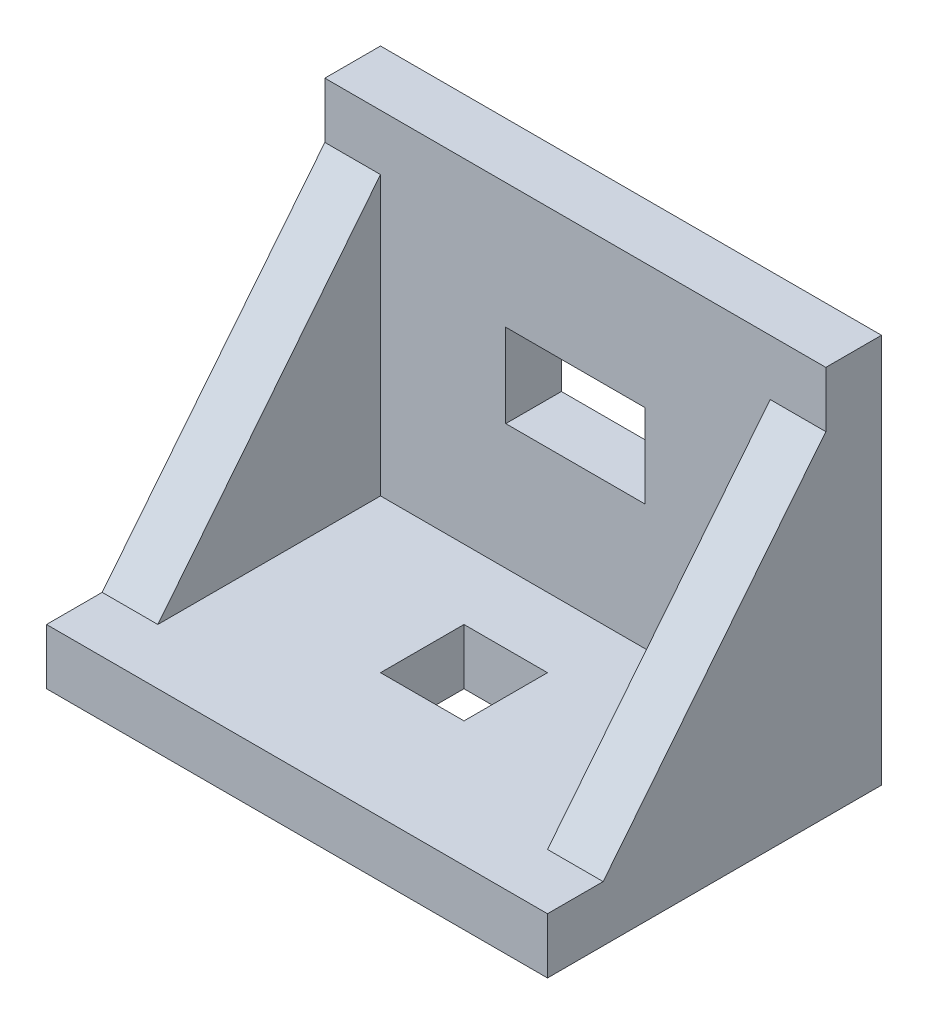
ISO-10303-21;
HEADER;
FILE_DESCRIPTION(('STEP AP214'),'2;1');
FILE_NAME('part.step','',(''),(''),'','','');
FILE_SCHEMA(('AUTOMOTIVE_DESIGN { 1 0 10303 214 1 1 1 1 }'));
ENDSEC;
DATA;
#1=APPLICATION_CONTEXT('core data for automotive mechanical design processes');
#2=APPLICATION_PROTOCOL_DEFINITION('international standard','automotive_design',2000,#1);
#3=PRODUCT_CONTEXT('',#1,'mechanical');
#4=PRODUCT('Part','Part','',(#3));
#5=PRODUCT_RELATED_PRODUCT_CATEGORY('part','',(#4));
#6=PRODUCT_DEFINITION_FORMATION('','',#4);
#7=PRODUCT_DEFINITION_CONTEXT('part definition',#1,'design');
#8=PRODUCT_DEFINITION('design','',#6,#7);
#9=PRODUCT_DEFINITION_SHAPE('','',#8);
#10=(LENGTH_UNIT() NAMED_UNIT(*) SI_UNIT(.MILLI.,.METRE.));
#11=(NAMED_UNIT(*) PLANE_ANGLE_UNIT() SI_UNIT($,.RADIAN.));
#12=(NAMED_UNIT(*) SI_UNIT($,.STERADIAN.) SOLID_ANGLE_UNIT());
#13=UNCERTAINTY_MEASURE_WITH_UNIT(LENGTH_MEASURE(1.E-05),#10,'distance_accuracy_value','');
#14=(GEOMETRIC_REPRESENTATION_CONTEXT(3) GLOBAL_UNCERTAINTY_ASSIGNED_CONTEXT((#13)) GLOBAL_UNIT_ASSIGNED_CONTEXT((#10,
#11,#12)) REPRESENTATION_CONTEXT('',''));
#15=CARTESIAN_POINT('',(0.,0.,0.));
#16=DIRECTION('',(0.,0.,1.));
#17=DIRECTION('',(1.,0.,0.));
#18=AXIS2_PLACEMENT_3D('',#15,#16,#17);
#19=CARTESIAN_POINT('',(45.,10.,-30.));
#20=DIRECTION('',(-1.,0.,0.));
#21=DIRECTION('',(0.,0.,1.));
#22=AXIS2_PLACEMENT_3D('',#19,#20,#21);
#23=PLANE('',#22);
#24=DIRECTION('',(0.,-1.,0.));
#25=VECTOR('',#24,1.);
#26=CARTESIAN_POINT('',(45.,70.,-20.));
#27=LINE('',#26,#25);
#28=CARTESIAN_POINT('',(45.,70.,-20.));
#29=VERTEX_POINT('',#28);
#30=CARTESIAN_POINT('',(45.,60.,-20.));
#31=VERTEX_POINT('',#30);
#32=EDGE_CURVE('E318',#29,#31,#27,.T.);
#33=ORIENTED_EDGE('',*,*,#32,.T.);
#34=DIRECTION('',(0.,0.78086880944303,-0.624695047554424));
#35=VECTOR('',#34,1.);
#36=CARTESIAN_POINT('',(45.,10.,20.));
#37=LINE('',#36,#35);
#38=CARTESIAN_POINT('',(45.,10.,20.));
#39=VERTEX_POINT('',#38);
#40=EDGE_CURVE('E190',#39,#31,#37,.T.);
#41=ORIENTED_EDGE('',*,*,#40,.F.);
#42=DIRECTION('',(0.,0.,-1.));
#43=VECTOR('',#42,1.);
#44=CARTESIAN_POINT('',(45.,10.,-30.));
#45=LINE('',#44,#43);
#46=CARTESIAN_POINT('',(45.,10.,30.));
#47=VERTEX_POINT('',#46);
#48=EDGE_CURVE('E63',#47,#39,#45,.T.);
#49=ORIENTED_EDGE('',*,*,#48,.F.);
#50=DIRECTION('',(0.,-1.,0.));
#51=VECTOR('',#50,1.);
#52=CARTESIAN_POINT('',(45.,10.,30.));
#53=LINE('',#52,#51);
#54=CARTESIAN_POINT('',(45.,0.,30.));
#55=VERTEX_POINT('',#54);
#56=EDGE_CURVE('E336',#47,#55,#53,.T.);
#57=ORIENTED_EDGE('',*,*,#56,.T.);
#58=DIRECTION('',(0.,0.,-1.));
#59=VECTOR('',#58,1.);
#60=CARTESIAN_POINT('',(45.,0.,-30.));
#61=LINE('',#60,#59);
#62=CARTESIAN_POINT('',(45.,0.,-30.));
#63=VERTEX_POINT('',#62);
#64=EDGE_CURVE('E326',#55,#63,#61,.T.);
#65=ORIENTED_EDGE('',*,*,#64,.T.);
#66=DIRECTION('',(0.,-1.,0.));
#67=VECTOR('',#66,1.);
#68=CARTESIAN_POINT('',(45.,10.,-30.));
#69=LINE('',#68,#67);
#70=CARTESIAN_POINT('',(45.,70.,-30.));
#71=VERTEX_POINT('',#70);
#72=EDGE_CURVE('E11',#71,#63,#69,.T.);
#73=ORIENTED_EDGE('',*,*,#72,.F.);
#74=DIRECTION('',(0.,0.,-1.));
#75=VECTOR('',#74,1.);
#76=CARTESIAN_POINT('',(45.,70.,-30.));
#77=LINE('',#76,#75);
#78=EDGE_CURVE('E313',#29,#71,#77,.T.);
#79=ORIENTED_EDGE('',*,*,#78,.F.);
#80=EDGE_LOOP('',(#33,#41,#49,#57,#65,#73,#79));
#81=FACE_BOUND('',#80,.T.);
#82=ADVANCED_FACE('F43',(#81),#23,.F.);
#83=CARTESIAN_POINT('',(-45.,10.,-30.));
#84=DIRECTION('',(0.,0.,1.));
#85=DIRECTION('',(1.,0.,0.));
#86=AXIS2_PLACEMENT_3D('',#83,#84,#85);
#87=PLANE('',#86);
#88=DIRECTION('',(-1.,0.,0.));
#89=VECTOR('',#88,1.);
#90=CARTESIAN_POINT('',(-45.,0.,-30.));
#91=LINE('',#90,#89);
#92=CARTESIAN_POINT('',(-45.,0.,-30.));
#93=VERTEX_POINT('',#92);
#94=EDGE_CURVE('E339',#63,#93,#91,.T.);
#95=ORIENTED_EDGE('',*,*,#94,.T.);
#96=DIRECTION('',(0.,-1.,0.));
#97=VECTOR('',#96,1.);
#98=CARTESIAN_POINT('',(-45.,10.,-30.));
#99=LINE('',#98,#97);
#100=CARTESIAN_POINT('',(-45.,70.,-30.));
#101=VERTEX_POINT('',#100);
#102=EDGE_CURVE('E51',#101,#93,#99,.T.);
#103=ORIENTED_EDGE('',*,*,#102,.F.);
#104=DIRECTION('',(-1.,0.,0.));
#105=VECTOR('',#104,1.);
#106=CARTESIAN_POINT('',(-45.,70.,-30.));
#107=LINE('',#106,#105);
#108=EDGE_CURVE('E316',#71,#101,#107,.T.);
#109=ORIENTED_EDGE('',*,*,#108,.F.);
#110=ORIENTED_EDGE('',*,*,#72,.T.);
#111=EDGE_LOOP('',(#95,#103,#109,#110));
#112=FACE_BOUND('',#111,.T.);
#113=DIRECTION('',(1.,0.,0.));
#114=VECTOR('',#113,1.);
#115=CARTESIAN_POINT('',(-12.5,32.5,-30.));
#116=LINE('',#115,#114);
#117=CARTESIAN_POINT('',(-12.5,32.5,-30.));
#118=VERTEX_POINT('',#117);
#119=CARTESIAN_POINT('',(12.5,32.5,-30.));
#120=VERTEX_POINT('',#119);
#121=EDGE_CURVE('E279',#118,#120,#116,.T.);
#122=ORIENTED_EDGE('',*,*,#121,.T.);
#123=DIRECTION('',(0.,1.,0.));
#124=VECTOR('',#123,1.);
#125=CARTESIAN_POINT('',(12.5,47.5,-30.));
#126=LINE('',#125,#124);
#127=CARTESIAN_POINT('',(12.5,47.5,-30.));
#128=VERTEX_POINT('',#127);
#129=EDGE_CURVE('E266',#120,#128,#126,.T.);
#130=ORIENTED_EDGE('',*,*,#129,.T.);
#131=DIRECTION('',(-1.,0.,0.));
#132=VECTOR('',#131,1.);
#133=CARTESIAN_POINT('',(-12.5,47.5,-30.));
#134=LINE('',#133,#132);
#135=CARTESIAN_POINT('',(-12.5,47.5,-30.));
#136=VERTEX_POINT('',#135);
#137=EDGE_CURVE('E270',#128,#136,#134,.T.);
#138=ORIENTED_EDGE('',*,*,#137,.T.);
#139=DIRECTION('',(0.,-1.,0.));
#140=VECTOR('',#139,1.);
#141=CARTESIAN_POINT('',(-12.5,47.5,-30.));
#142=LINE('',#141,#140);
#143=EDGE_CURVE('E275',#136,#118,#142,.T.);
#144=ORIENTED_EDGE('',*,*,#143,.T.);
#145=EDGE_LOOP('',(#122,#130,#138,#144));
#146=FACE_BOUND('',#145,.T.);
#147=ADVANCED_FACE('F385',(#112,#146),#87,.F.);
#148=CARTESIAN_POINT('',(-45.,10.,-30.));
#149=DIRECTION('',(1.,0.,0.));
#150=DIRECTION('',(0.,0.,-1.));
#151=AXIS2_PLACEMENT_3D('',#148,#149,#150);
#152=PLANE('',#151);
#153=DIRECTION('',(0.,0.,1.));
#154=VECTOR('',#153,1.);
#155=CARTESIAN_POINT('',(-45.,0.,-30.));
#156=LINE('',#155,#154);
#157=CARTESIAN_POINT('',(-45.,0.,30.));
#158=VERTEX_POINT('',#157);
#159=EDGE_CURVE('E342',#93,#158,#156,.T.);
#160=ORIENTED_EDGE('',*,*,#159,.T.);
#161=DIRECTION('',(0.,-1.,0.));
#162=VECTOR('',#161,1.);
#163=CARTESIAN_POINT('',(-45.,10.,30.));
#164=LINE('',#163,#162);
#165=CARTESIAN_POINT('',(-45.,10.,30.));
#166=VERTEX_POINT('',#165);
#167=EDGE_CURVE('E350',#166,#158,#164,.T.);
#168=ORIENTED_EDGE('',*,*,#167,.F.);
#169=DIRECTION('',(0.,0.,1.));
#170=VECTOR('',#169,1.);
#171=CARTESIAN_POINT('',(-45.,10.,-30.));
#172=LINE('',#171,#170);
#173=CARTESIAN_POINT('',(-45.,10.,20.));
#174=VERTEX_POINT('',#173);
#175=EDGE_CURVE('E329',#174,#166,#172,.T.);
#176=ORIENTED_EDGE('',*,*,#175,.F.);
#177=DIRECTION('',(0.,0.78086880944303,-0.624695047554424));
#178=VECTOR('',#177,1.);
#179=CARTESIAN_POINT('',(-45.,10.,20.));
#180=LINE('',#179,#178);
#181=CARTESIAN_POINT('',(-45.,60.,-20.));
#182=VERTEX_POINT('',#181);
#183=EDGE_CURVE('E202',#174,#182,#180,.T.);
#184=ORIENTED_EDGE('',*,*,#183,.T.);
#185=DIRECTION('',(0.,-1.,0.));
#186=VECTOR('',#185,1.);
#187=CARTESIAN_POINT('',(-45.,70.,-20.));
#188=LINE('',#187,#186);
#189=CARTESIAN_POINT('',(-45.,70.,-20.));
#190=VERTEX_POINT('',#189);
#191=EDGE_CURVE('E323',#190,#182,#188,.T.);
#192=ORIENTED_EDGE('',*,*,#191,.F.);
#193=DIRECTION('',(0.,0.,1.));
#194=VECTOR('',#193,1.);
#195=CARTESIAN_POINT('',(-45.,70.,-30.));
#196=LINE('',#195,#194);
#197=EDGE_CURVE('E175',#101,#190,#196,.T.);
#198=ORIENTED_EDGE('',*,*,#197,.F.);
#199=ORIENTED_EDGE('',*,*,#102,.T.);
#200=EDGE_LOOP('',(#160,#168,#176,#184,#192,#198,#199));
#201=FACE_BOUND('',#200,.T.);
#202=ADVANCED_FACE('F359',(#201),#152,.F.);
#203=CARTESIAN_POINT('',(-45.,10.,30.));
#204=DIRECTION('',(0.,0.,-1.));
#205=DIRECTION('',(-1.,0.,0.));
#206=AXIS2_PLACEMENT_3D('',#203,#204,#205);
#207=PLANE('',#206);
#208=DIRECTION('',(1.,0.,0.));
#209=VECTOR('',#208,1.);
#210=CARTESIAN_POINT('',(-45.,0.,30.));
#211=LINE('',#210,#209);
#212=EDGE_CURVE('E330',#158,#55,#211,.T.);
#213=ORIENTED_EDGE('',*,*,#212,.T.);
#214=ORIENTED_EDGE('',*,*,#56,.F.);
#215=DIRECTION('',(1.,0.,0.));
#216=VECTOR('',#215,1.);
#217=CARTESIAN_POINT('',(-45.,10.,30.));
#218=LINE('',#217,#216);
#219=EDGE_CURVE('E333',#166,#47,#218,.T.);
#220=ORIENTED_EDGE('',*,*,#219,.F.);
#221=ORIENTED_EDGE('',*,*,#167,.T.);
#222=EDGE_LOOP('',(#213,#214,#220,#221));
#223=FACE_BOUND('',#222,.T.);
#224=ADVANCED_FACE('F372',(#223),#207,.F.);
#225=CARTESIAN_POINT('',(0.,10.,0.));
#226=DIRECTION('',(0.,1.,0.));
#227=DIRECTION('',(0.,0.,1.));
#228=AXIS2_PLACEMENT_3D('',#225,#226,#227);
#229=PLANE('',#228);
#230=DIRECTION('',(-1.,0.,0.));
#231=VECTOR('',#230,1.);
#232=CARTESIAN_POINT('',(0.,10.,20.));
#233=LINE('',#232,#231);
#234=CARTESIAN_POINT('',(35.,10.,20.));
#235=VERTEX_POINT('',#234);
#236=EDGE_CURVE('E58',#235,#39,#233,.F.);
#237=ORIENTED_EDGE('',*,*,#236,.F.);
#238=DIRECTION('',(0.,0.,-1.));
#239=VECTOR('',#238,1.);
#240=CARTESIAN_POINT('',(35.,10.,0.));
#241=LINE('',#240,#239);
#242=CARTESIAN_POINT('',(35.,10.,-20.));
#243=VERTEX_POINT('',#242);
#244=EDGE_CURVE('E178',#235,#243,#241,.T.);
#245=ORIENTED_EDGE('',*,*,#244,.T.);
#246=DIRECTION('',(1.,0.,0.));
#247=VECTOR('',#246,1.);
#248=CARTESIAN_POINT('',(-45.,10.,-20.));
#249=LINE('',#248,#247);
#250=CARTESIAN_POINT('',(-35.,10.,-20.));
#251=VERTEX_POINT('',#250);
#252=EDGE_CURVE('E166',#251,#243,#249,.T.);
#253=ORIENTED_EDGE('',*,*,#252,.F.);
#254=DIRECTION('',(0.,0.,1.));
#255=VECTOR('',#254,1.);
#256=CARTESIAN_POINT('',(-35.,10.,0.));
#257=LINE('',#256,#255);
#258=CARTESIAN_POINT('',(-35.,10.,20.));
#259=VERTEX_POINT('',#258);
#260=EDGE_CURVE('E211',#251,#259,#257,.T.);
#261=ORIENTED_EDGE('',*,*,#260,.T.);
#262=DIRECTION('',(1.,0.,0.));
#263=VECTOR('',#262,1.);
#264=CARTESIAN_POINT('',(0.,10.,20.));
#265=LINE('',#264,#263);
#266=EDGE_CURVE('E217',#174,#259,#265,.T.);
#267=ORIENTED_EDGE('',*,*,#266,.F.);
#268=ORIENTED_EDGE('',*,*,#175,.T.);
#269=ORIENTED_EDGE('',*,*,#219,.T.);
#270=ORIENTED_EDGE('',*,*,#48,.T.);
#271=EDGE_LOOP('',(#237,#245,#253,#261,#267,#268,#269,#270));
#272=FACE_BOUND('',#271,.T.);
#273=DIRECTION('',(0.,0.,-1.));
#274=VECTOR('',#273,1.);
#275=CARTESIAN_POINT('',(7.5,10.,-7.5));
#276=LINE('',#275,#274);
#277=CARTESIAN_POINT('',(7.5,10.,7.5));
#278=VERTEX_POINT('',#277);
#279=CARTESIAN_POINT('',(7.5,10.,-7.5));
#280=VERTEX_POINT('',#279);
#281=EDGE_CURVE('E221',#278,#280,#276,.T.);
#282=ORIENTED_EDGE('',*,*,#281,.F.);
#283=DIRECTION('',(1.,0.,0.));
#284=VECTOR('',#283,1.);
#285=CARTESIAN_POINT('',(-7.5,10.,7.5));
#286=LINE('',#285,#284);
#287=CARTESIAN_POINT('',(-7.5,10.,7.5));
#288=VERTEX_POINT('',#287);
#289=EDGE_CURVE('E227',#288,#278,#286,.T.);
#290=ORIENTED_EDGE('',*,*,#289,.F.);
#291=DIRECTION('',(0.,0.,1.));
#292=VECTOR('',#291,1.);
#293=CARTESIAN_POINT('',(-7.5,10.,-7.5));
#294=LINE('',#293,#292);
#295=CARTESIAN_POINT('',(-7.5,10.,-7.5));
#296=VERTEX_POINT('',#295);
#297=EDGE_CURVE('E246',#296,#288,#294,.T.);
#298=ORIENTED_EDGE('',*,*,#297,.F.);
#299=DIRECTION('',(-1.,0.,0.));
#300=VECTOR('',#299,1.);
#301=CARTESIAN_POINT('',(-7.5,10.,-7.5));
#302=LINE('',#301,#300);
#303=EDGE_CURVE('E242',#280,#296,#302,.T.);
#304=ORIENTED_EDGE('',*,*,#303,.F.);
#305=EDGE_LOOP('',(#282,#290,#298,#304));
#306=FACE_BOUND('',#305,.T.);
#307=ADVANCED_FACE('F179',(#272,#306),#229,.T.);
#308=CARTESIAN_POINT('',(0.,0.,0.));
#309=DIRECTION('',(0.,1.,0.));
#310=DIRECTION('',(0.,0.,1.));
#311=AXIS2_PLACEMENT_3D('',#308,#309,#310);
#312=PLANE('',#311);
#313=ORIENTED_EDGE('',*,*,#94,.F.);
#314=ORIENTED_EDGE('',*,*,#64,.F.);
#315=ORIENTED_EDGE('',*,*,#212,.F.);
#316=ORIENTED_EDGE('',*,*,#159,.F.);
#317=EDGE_LOOP('',(#313,#314,#315,#316));
#318=FACE_BOUND('',#317,.T.);
#319=DIRECTION('',(1.,0.,0.));
#320=VECTOR('',#319,1.);
#321=CARTESIAN_POINT('',(-7.5,0.,7.5));
#322=LINE('',#321,#320);
#323=CARTESIAN_POINT('',(-7.5,0.,7.5));
#324=VERTEX_POINT('',#323);
#325=CARTESIAN_POINT('',(7.5,0.,7.5));
#326=VERTEX_POINT('',#325);
#327=EDGE_CURVE('E235',#324,#326,#322,.T.);
#328=ORIENTED_EDGE('',*,*,#327,.T.);
#329=DIRECTION('',(0.,0.,-1.));
#330=VECTOR('',#329,1.);
#331=CARTESIAN_POINT('',(7.5,0.,-7.5));
#332=LINE('',#331,#330);
#333=CARTESIAN_POINT('',(7.5,0.,-7.5));
#334=VERTEX_POINT('',#333);
#335=EDGE_CURVE('E222',#326,#334,#332,.T.);
#336=ORIENTED_EDGE('',*,*,#335,.T.);
#337=DIRECTION('',(-1.,0.,0.));
#338=VECTOR('',#337,1.);
#339=CARTESIAN_POINT('',(-7.5,0.,-7.5));
#340=LINE('',#339,#338);
#341=CARTESIAN_POINT('',(-7.5,0.,-7.5));
#342=VERTEX_POINT('',#341);
#343=EDGE_CURVE('E226',#334,#342,#340,.T.);
#344=ORIENTED_EDGE('',*,*,#343,.T.);
#345=DIRECTION('',(0.,0.,1.));
#346=VECTOR('',#345,1.);
#347=CARTESIAN_POINT('',(-7.5,0.,-7.5));
#348=LINE('',#347,#346);
#349=EDGE_CURVE('E231',#342,#324,#348,.T.);
#350=ORIENTED_EDGE('',*,*,#349,.T.);
#351=EDGE_LOOP('',(#328,#336,#344,#350));
#352=FACE_BOUND('',#351,.T.);
#353=ADVANCED_FACE('F367',(#318,#352),#312,.F.);
#354=CARTESIAN_POINT('',(-45.,70.,-20.));
#355=DIRECTION('',(0.,0.,-1.));
#356=DIRECTION('',(-1.,0.,0.));
#357=AXIS2_PLACEMENT_3D('',#354,#355,#356);
#358=PLANE('',#357);
#359=DIRECTION('',(-1.,0.,0.));
#360=VECTOR('',#359,1.);
#361=CARTESIAN_POINT('',(-12.5,47.5,-20.));
#362=LINE('',#361,#360);
#363=CARTESIAN_POINT('',(12.5,47.5,-20.));
#364=VERTEX_POINT('',#363);
#365=CARTESIAN_POINT('',(-12.5,47.5,-20.));
#366=VERTEX_POINT('',#365);
#367=EDGE_CURVE('E286',#364,#366,#362,.T.);
#368=ORIENTED_EDGE('',*,*,#367,.F.);
#369=DIRECTION('',(0.,1.,0.));
#370=VECTOR('',#369,1.);
#371=CARTESIAN_POINT('',(12.5,47.5,-20.));
#372=LINE('',#371,#370);
#373=CARTESIAN_POINT('',(12.5,32.5,-20.));
#374=VERTEX_POINT('',#373);
#375=EDGE_CURVE('E256',#374,#364,#372,.T.);
#376=ORIENTED_EDGE('',*,*,#375,.F.);
#377=DIRECTION('',(1.,0.,0.));
#378=VECTOR('',#377,1.);
#379=CARTESIAN_POINT('',(-12.5,32.5,-20.));
#380=LINE('',#379,#378);
#381=CARTESIAN_POINT('',(-12.5,32.5,-20.));
#382=VERTEX_POINT('',#381);
#383=EDGE_CURVE('E271',#382,#374,#380,.T.);
#384=ORIENTED_EDGE('',*,*,#383,.F.);
#385=DIRECTION('',(0.,-1.,0.));
#386=VECTOR('',#385,1.);
#387=CARTESIAN_POINT('',(-12.5,47.5,-20.));
#388=LINE('',#387,#386);
#389=EDGE_CURVE('E290',#366,#382,#388,.T.);
#390=ORIENTED_EDGE('',*,*,#389,.F.);
#391=EDGE_LOOP('',(#368,#376,#384,#390));
#392=FACE_BOUND('',#391,.T.);
#393=DIRECTION('',(0.,-1.,0.));
#394=VECTOR('',#393,1.);
#395=CARTESIAN_POINT('',(35.,70.,-20.));
#396=LINE('',#395,#394);
#397=CARTESIAN_POINT('',(35.,60.,-20.));
#398=VERTEX_POINT('',#397);
#399=EDGE_CURVE('E169',#398,#243,#396,.T.);
#400=ORIENTED_EDGE('',*,*,#399,.F.);
#401=DIRECTION('',(-1.,0.,0.));
#402=VECTOR('',#401,1.);
#403=CARTESIAN_POINT('',(-45.,60.,-20.));
#404=LINE('',#403,#402);
#405=EDGE_CURVE('E185',#398,#31,#404,.F.);
#406=ORIENTED_EDGE('',*,*,#405,.T.);
#407=ORIENTED_EDGE('',*,*,#32,.F.);
#408=DIRECTION('',(1.,0.,0.));
#409=VECTOR('',#408,1.);
#410=CARTESIAN_POINT('',(-45.,70.,-20.));
#411=LINE('',#410,#409);
#412=EDGE_CURVE('E310',#190,#29,#411,.T.);
#413=ORIENTED_EDGE('',*,*,#412,.F.);
#414=ORIENTED_EDGE('',*,*,#191,.T.);
#415=DIRECTION('',(1.,0.,0.));
#416=VECTOR('',#415,1.);
#417=CARTESIAN_POINT('',(-45.,60.,-20.));
#418=LINE('',#417,#416);
#419=CARTESIAN_POINT('',(-35.,60.,-20.));
#420=VERTEX_POINT('',#419);
#421=EDGE_CURVE('E214',#182,#420,#418,.T.);
#422=ORIENTED_EDGE('',*,*,#421,.T.);
#423=DIRECTION('',(0.,1.,0.));
#424=VECTOR('',#423,1.);
#425=CARTESIAN_POINT('',(-35.,70.,-20.));
#426=LINE('',#425,#424);
#427=EDGE_CURVE('E172',#251,#420,#426,.T.);
#428=ORIENTED_EDGE('',*,*,#427,.F.);
#429=ORIENTED_EDGE('',*,*,#252,.T.);
#430=EDGE_LOOP('',(#400,#406,#407,#413,#414,#422,#428,#429));
#431=FACE_BOUND('',#430,.T.);
#432=ADVANCED_FACE('F167',(#392,#431),#358,.F.);
#433=CARTESIAN_POINT('',(0.,70.,0.));
#434=DIRECTION('',(0.,1.,0.));
#435=DIRECTION('',(0.,0.,1.));
#436=AXIS2_PLACEMENT_3D('',#433,#434,#435);
#437=PLANE('',#436);
#438=ORIENTED_EDGE('',*,*,#78,.T.);
#439=ORIENTED_EDGE('',*,*,#108,.T.);
#440=ORIENTED_EDGE('',*,*,#197,.T.);
#441=ORIENTED_EDGE('',*,*,#412,.T.);
#442=EDGE_LOOP('',(#438,#439,#440,#441));
#443=FACE_BOUND('',#442,.T.);
#444=ADVANCED_FACE('F384',(#443),#437,.T.);
#445=CARTESIAN_POINT('',(12.5,47.5,-30.));
#446=DIRECTION('',(1.,0.,0.));
#447=DIRECTION('',(0.,1.,0.));
#448=AXIS2_PLACEMENT_3D('',#445,#446,#447);
#449=PLANE('',#448);
#450=ORIENTED_EDGE('',*,*,#375,.T.);
#451=DIRECTION('',(0.,0.,1.));
#452=VECTOR('',#451,1.);
#453=CARTESIAN_POINT('',(12.5,47.5,-30.));
#454=LINE('',#453,#452);
#455=EDGE_CURVE('E283',#128,#364,#454,.T.);
#456=ORIENTED_EDGE('',*,*,#455,.F.);
#457=ORIENTED_EDGE('',*,*,#129,.F.);
#458=DIRECTION('',(0.,0.,1.));
#459=VECTOR('',#458,1.);
#460=CARTESIAN_POINT('',(12.5,32.5,-30.));
#461=LINE('',#460,#459);
#462=EDGE_CURVE('E176',#120,#374,#461,.T.);
#463=ORIENTED_EDGE('',*,*,#462,.T.);
#464=EDGE_LOOP('',(#450,#456,#457,#463));
#465=FACE_BOUND('',#464,.T.);
#466=ADVANCED_FACE('F395',(#465),#449,.F.);
#467=CARTESIAN_POINT('',(-12.5,32.5,-30.));
#468=DIRECTION('',(0.,-1.,0.));
#469=DIRECTION('',(0.,0.,-1.));
#470=AXIS2_PLACEMENT_3D('',#467,#468,#469);
#471=PLANE('',#470);
#472=ORIENTED_EDGE('',*,*,#383,.T.);
#473=ORIENTED_EDGE('',*,*,#462,.F.);
#474=ORIENTED_EDGE('',*,*,#121,.F.);
#475=DIRECTION('',(0.,0.,1.));
#476=VECTOR('',#475,1.);
#477=CARTESIAN_POINT('',(-12.5,32.5,-30.));
#478=LINE('',#477,#476);
#479=EDGE_CURVE('E299',#118,#382,#478,.T.);
#480=ORIENTED_EDGE('',*,*,#479,.T.);
#481=EDGE_LOOP('',(#472,#473,#474,#480));
#482=FACE_BOUND('',#481,.T.);
#483=ADVANCED_FACE('F391',(#482),#471,.F.);
#484=CARTESIAN_POINT('',(-12.5,47.5,-30.));
#485=DIRECTION('',(-1.,0.,0.));
#486=DIRECTION('',(0.,-1.,0.));
#487=AXIS2_PLACEMENT_3D('',#484,#485,#486);
#488=PLANE('',#487);
#489=ORIENTED_EDGE('',*,*,#389,.T.);
#490=ORIENTED_EDGE('',*,*,#479,.F.);
#491=ORIENTED_EDGE('',*,*,#143,.F.);
#492=DIRECTION('',(0.,0.,1.));
#493=VECTOR('',#492,1.);
#494=CARTESIAN_POINT('',(-12.5,47.5,-30.));
#495=LINE('',#494,#493);
#496=EDGE_CURVE('E302',#136,#366,#495,.T.);
#497=ORIENTED_EDGE('',*,*,#496,.T.);
#498=EDGE_LOOP('',(#489,#490,#491,#497));
#499=FACE_BOUND('',#498,.T.);
#500=ADVANCED_FACE('F403',(#499),#488,.F.);
#501=CARTESIAN_POINT('',(-12.5,47.5,-30.));
#502=DIRECTION('',(0.,1.,0.));
#503=DIRECTION('',(0.,0.,1.));
#504=AXIS2_PLACEMENT_3D('',#501,#502,#503);
#505=PLANE('',#504);
#506=ORIENTED_EDGE('',*,*,#367,.T.);
#507=ORIENTED_EDGE('',*,*,#496,.F.);
#508=ORIENTED_EDGE('',*,*,#137,.F.);
#509=ORIENTED_EDGE('',*,*,#455,.T.);
#510=EDGE_LOOP('',(#506,#507,#508,#509));
#511=FACE_BOUND('',#510,.T.);
#512=ADVANCED_FACE('F400',(#511),#505,.F.);
#513=CARTESIAN_POINT('',(7.5,0.,-7.5));
#514=DIRECTION('',(1.,0.,0.));
#515=DIRECTION('',(0.,0.,-1.));
#516=AXIS2_PLACEMENT_3D('',#513,#514,#515);
#517=PLANE('',#516);
#518=ORIENTED_EDGE('',*,*,#281,.T.);
#519=DIRECTION('',(0.,1.,0.));
#520=VECTOR('',#519,1.);
#521=CARTESIAN_POINT('',(7.5,0.,-7.5));
#522=LINE('',#521,#520);
#523=EDGE_CURVE('E239',#334,#280,#522,.T.);
#524=ORIENTED_EDGE('',*,*,#523,.F.);
#525=ORIENTED_EDGE('',*,*,#335,.F.);
#526=DIRECTION('',(0.,1.,0.));
#527=VECTOR('',#526,1.);
#528=CARTESIAN_POINT('',(7.5,0.,7.5));
#529=LINE('',#528,#527);
#530=EDGE_CURVE('E253',#326,#278,#529,.T.);
#531=ORIENTED_EDGE('',*,*,#530,.T.);
#532=EDGE_LOOP('',(#518,#524,#525,#531));
#533=FACE_BOUND('',#532,.T.);
#534=ADVANCED_FACE('F530',(#533),#517,.F.);
#535=CARTESIAN_POINT('',(-7.5,0.,7.5));
#536=DIRECTION('',(0.,0.,1.));
#537=DIRECTION('',(1.,0.,0.));
#538=AXIS2_PLACEMENT_3D('',#535,#536,#537);
#539=PLANE('',#538);
#540=ORIENTED_EDGE('',*,*,#289,.T.);
#541=ORIENTED_EDGE('',*,*,#530,.F.);
#542=ORIENTED_EDGE('',*,*,#327,.F.);
#543=DIRECTION('',(0.,1.,0.));
#544=VECTOR('',#543,1.);
#545=CARTESIAN_POINT('',(-7.5,0.,7.5));
#546=LINE('',#545,#544);
#547=EDGE_CURVE('E257',#324,#288,#546,.T.);
#548=ORIENTED_EDGE('',*,*,#547,.T.);
#549=EDGE_LOOP('',(#540,#541,#542,#548));
#550=FACE_BOUND('',#549,.T.);
#551=ADVANCED_FACE('F520',(#550),#539,.F.);
#552=CARTESIAN_POINT('',(-7.5,0.,-7.5));
#553=DIRECTION('',(-1.,0.,0.));
#554=DIRECTION('',(0.,0.,1.));
#555=AXIS2_PLACEMENT_3D('',#552,#553,#554);
#556=PLANE('',#555);
#557=ORIENTED_EDGE('',*,*,#297,.T.);
#558=ORIENTED_EDGE('',*,*,#547,.F.);
#559=ORIENTED_EDGE('',*,*,#349,.F.);
#560=DIRECTION('',(0.,1.,0.));
#561=VECTOR('',#560,1.);
#562=CARTESIAN_POINT('',(-7.5,0.,-7.5));
#563=LINE('',#562,#561);
#564=EDGE_CURVE('E260',#342,#296,#563,.T.);
#565=ORIENTED_EDGE('',*,*,#564,.T.);
#566=EDGE_LOOP('',(#557,#558,#559,#565));
#567=FACE_BOUND('',#566,.T.);
#568=ADVANCED_FACE('F511',(#567),#556,.F.);
#569=CARTESIAN_POINT('',(-7.5,0.,-7.5));
#570=DIRECTION('',(0.,0.,-1.));
#571=DIRECTION('',(-1.,0.,0.));
#572=AXIS2_PLACEMENT_3D('',#569,#570,#571);
#573=PLANE('',#572);
#574=ORIENTED_EDGE('',*,*,#303,.T.);
#575=ORIENTED_EDGE('',*,*,#564,.F.);
#576=ORIENTED_EDGE('',*,*,#343,.F.);
#577=ORIENTED_EDGE('',*,*,#523,.T.);
#578=EDGE_LOOP('',(#574,#575,#576,#577));
#579=FACE_BOUND('',#578,.T.);
#580=ADVANCED_FACE('F502',(#579),#573,.F.);
#581=CARTESIAN_POINT('',(-45.,10.,20.));
#582=DIRECTION('',(0.,0.624695047554424,0.78086880944303));
#583=DIRECTION('',(0.,0.78086880944303,-0.624695047554424));
#584=AXIS2_PLACEMENT_3D('',#581,#582,#583);
#585=PLANE('',#584);
#586=ORIENTED_EDGE('',*,*,#183,.F.);
#587=ORIENTED_EDGE('',*,*,#266,.T.);
#588=DIRECTION('',(0.,0.78086880944303,-0.624695047554424));
#589=VECTOR('',#588,1.);
#590=CARTESIAN_POINT('',(-35.,10.,20.));
#591=LINE('',#590,#589);
#592=EDGE_CURVE('E201',#259,#420,#591,.T.);
#593=ORIENTED_EDGE('',*,*,#592,.T.);
#594=ORIENTED_EDGE('',*,*,#421,.F.);
#595=EDGE_LOOP('',(#586,#587,#593,#594));
#596=FACE_BOUND('',#595,.T.);
#597=ADVANCED_FACE('F493',(#596),#585,.T.);
#598=CARTESIAN_POINT('',(-35.,35.,0.));
#599=DIRECTION('',(-1.,0.,0.));
#600=DIRECTION('',(0.,0.,1.));
#601=AXIS2_PLACEMENT_3D('',#598,#599,#600);
#602=PLANE('',#601);
#603=ORIENTED_EDGE('',*,*,#260,.F.);
#604=ORIENTED_EDGE('',*,*,#427,.T.);
#605=ORIENTED_EDGE('',*,*,#592,.F.);
#606=EDGE_LOOP('',(#603,#604,#605));
#607=FACE_BOUND('',#606,.T.);
#608=ADVANCED_FACE('F472',(#607),#602,.F.);
#609=CARTESIAN_POINT('',(45.,10.,20.));
#610=DIRECTION('',(0.,-0.624695047554424,-0.78086880944303));
#611=DIRECTION('',(0.,0.78086880944303,-0.624695047554424));
#612=AXIS2_PLACEMENT_3D('',#609,#610,#611);
#613=PLANE('',#612);
#614=DIRECTION('',(0.,0.78086880944303,-0.624695047554424));
#615=VECTOR('',#614,1.);
#616=CARTESIAN_POINT('',(35.,10.,20.));
#617=LINE('',#616,#615);
#618=EDGE_CURVE('E188',#235,#398,#617,.T.);
#619=ORIENTED_EDGE('',*,*,#618,.F.);
#620=ORIENTED_EDGE('',*,*,#236,.T.);
#621=ORIENTED_EDGE('',*,*,#40,.T.);
#622=ORIENTED_EDGE('',*,*,#405,.F.);
#623=EDGE_LOOP('',(#619,#620,#621,#622));
#624=FACE_BOUND('',#623,.T.);
#625=ADVANCED_FACE('F380',(#624),#613,.F.);
#626=CARTESIAN_POINT('',(35.,35.,0.));
#627=DIRECTION('',(1.,0.,0.));
#628=DIRECTION('',(0.,0.,-1.));
#629=AXIS2_PLACEMENT_3D('',#626,#627,#628);
#630=PLANE('',#629);
#631=ORIENTED_EDGE('',*,*,#244,.F.);
#632=ORIENTED_EDGE('',*,*,#618,.T.);
#633=ORIENTED_EDGE('',*,*,#399,.T.);
#634=EDGE_LOOP('',(#631,#632,#633));
#635=FACE_BOUND('',#634,.T.);
#636=ADVANCED_FACE('F187',(#635),#630,.F.);
#637=CLOSED_SHELL('',(#82,#147,#202,#224,#307,#353,#432,#444,#466,#483,#500,#512,#534,#551,#568,
#580,#597,#608,#625,#636));
#638=MANIFOLD_SOLID_BREP('B2',#637);
#639=ADVANCED_BREP_SHAPE_REPRESENTATION('',(#18,#638),#14);
#640=SHAPE_DEFINITION_REPRESENTATION(#9,#639);
ENDSEC;
END-ISO-10303-21;
